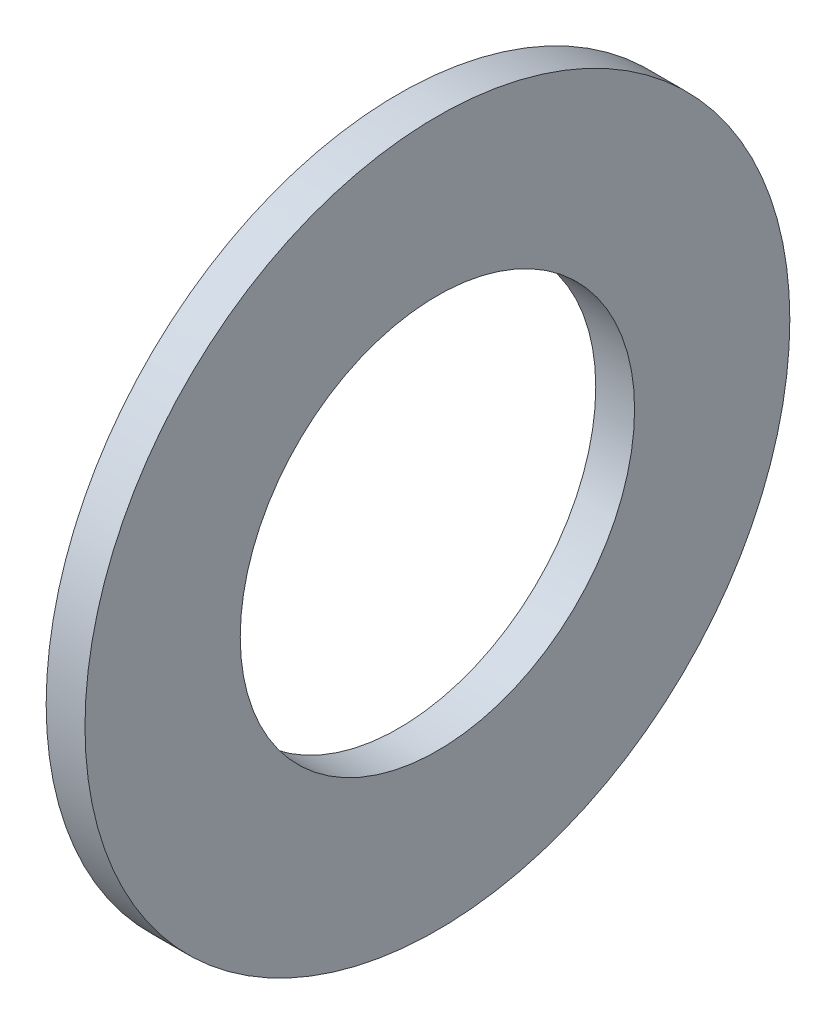
ISO-10303-21;
HEADER;
FILE_DESCRIPTION(('STEP AP214'),'2;1');
FILE_NAME('part.step','',(''),(''),'','','');
FILE_SCHEMA(('AUTOMOTIVE_DESIGN { 1 0 10303 214 1 1 1 1 }'));
ENDSEC;
DATA;
#1=APPLICATION_CONTEXT('core data for automotive mechanical design processes');
#2=APPLICATION_PROTOCOL_DEFINITION('international standard','automotive_design',2000,#1);
#3=PRODUCT_CONTEXT('',#1,'mechanical');
#4=PRODUCT('Part','Part','',(#3));
#5=PRODUCT_RELATED_PRODUCT_CATEGORY('part','',(#4));
#6=PRODUCT_DEFINITION_FORMATION('','',#4);
#7=PRODUCT_DEFINITION_CONTEXT('part definition',#1,'design');
#8=PRODUCT_DEFINITION('design','',#6,#7);
#9=PRODUCT_DEFINITION_SHAPE('','',#8);
#10=(LENGTH_UNIT() NAMED_UNIT(*) SI_UNIT(.MILLI.,.METRE.));
#11=(NAMED_UNIT(*) PLANE_ANGLE_UNIT() SI_UNIT($,.RADIAN.));
#12=(NAMED_UNIT(*) SI_UNIT($,.STERADIAN.) SOLID_ANGLE_UNIT());
#13=UNCERTAINTY_MEASURE_WITH_UNIT(LENGTH_MEASURE(1.E-05),#10,'distance_accuracy_value','');
#14=(GEOMETRIC_REPRESENTATION_CONTEXT(3) GLOBAL_UNCERTAINTY_ASSIGNED_CONTEXT((#13)) GLOBAL_UNIT_ASSIGNED_CONTEXT((#10,
#11,#12)) REPRESENTATION_CONTEXT('',''));
#15=CARTESIAN_POINT('',(0.,0.,0.));
#16=DIRECTION('',(0.,0.,1.));
#17=DIRECTION('',(1.,0.,0.));
#18=AXIS2_PLACEMENT_3D('',#15,#16,#17);
#19=CARTESIAN_POINT('',(5.,0.,0.));
#20=DIRECTION('',(1.,0.,0.));
#21=DIRECTION('',(0.,0.,-1.));
#22=AXIS2_PLACEMENT_3D('',#19,#20,#21);
#23=PLANE('',#22);
#24=CARTESIAN_POINT('',(5.,0.,0.));
#25=DIRECTION('',(1.,0.,0.));
#26=DIRECTION('',(0.,0.,-1.));
#27=AXIS2_PLACEMENT_3D('',#24,#25,#26);
#28=CIRCLE('',#27,45.4);
#29=CARTESIAN_POINT('',(5.,0.,-45.4));
#30=VERTEX_POINT('',#29);
#31=EDGE_CURVE('E10',#30,#30,#28,.T.);
#32=ORIENTED_EDGE('',*,*,#31,.T.);
#33=EDGE_LOOP('',(#32));
#34=FACE_BOUND('',#33,.T.);
#35=CARTESIAN_POINT('',(5.,0.,0.));
#36=DIRECTION('',(1.,0.,0.));
#37=DIRECTION('',(0.,0.,-1.));
#38=AXIS2_PLACEMENT_3D('',#35,#36,#37);
#39=CIRCLE('',#38,25.4);
#40=CARTESIAN_POINT('',(5.,0.,-25.4));
#41=VERTEX_POINT('',#40);
#42=EDGE_CURVE('E42',#41,#41,#39,.T.);
#43=ORIENTED_EDGE('',*,*,#42,.F.);
#44=EDGE_LOOP('',(#43));
#45=FACE_BOUND('',#44,.T.);
#46=ADVANCED_FACE('F31',(#34,#45),#23,.T.);
#47=CARTESIAN_POINT('',(0.,0.,0.));
#48=DIRECTION('',(1.,0.,0.));
#49=DIRECTION('',(0.,0.,-1.));
#50=AXIS2_PLACEMENT_3D('',#47,#48,#49);
#51=PLANE('',#50);
#52=CARTESIAN_POINT('',(0.,0.,0.));
#53=DIRECTION('',(1.,0.,0.));
#54=DIRECTION('',(0.,0.,-1.));
#55=AXIS2_PLACEMENT_3D('',#52,#53,#54);
#56=CIRCLE('',#55,45.4);
#57=CARTESIAN_POINT('',(0.,0.,-45.4));
#58=VERTEX_POINT('',#57);
#59=EDGE_CURVE('E35',#58,#58,#56,.T.);
#60=ORIENTED_EDGE('',*,*,#59,.F.);
#61=EDGE_LOOP('',(#60));
#62=FACE_BOUND('',#61,.T.);
#63=CARTESIAN_POINT('',(0.,0.,0.));
#64=DIRECTION('',(1.,0.,0.));
#65=DIRECTION('',(0.,0.,-1.));
#66=AXIS2_PLACEMENT_3D('',#63,#64,#65);
#67=CIRCLE('',#66,25.4);
#68=CARTESIAN_POINT('',(0.,0.,-25.4));
#69=VERTEX_POINT('',#68);
#70=EDGE_CURVE('E44',#69,#69,#67,.T.);
#71=ORIENTED_EDGE('',*,*,#70,.T.);
#72=EDGE_LOOP('',(#71));
#73=FACE_BOUND('',#72,.T.);
#74=ADVANCED_FACE('F54',(#62,#73),#51,.F.);
#75=CARTESIAN_POINT('',(5.,0.,0.));
#76=DIRECTION('',(-1.,0.,0.));
#77=DIRECTION('',(0.,0.,1.));
#78=AXIS2_PLACEMENT_3D('',#75,#76,#77);
#79=CYLINDRICAL_SURFACE('',#78,45.4);
#80=ORIENTED_EDGE('',*,*,#31,.F.);
#81=EDGE_LOOP('',(#80));
#82=FACE_BOUND('',#81,.T.);
#83=ORIENTED_EDGE('',*,*,#59,.T.);
#84=EDGE_LOOP('',(#83));
#85=FACE_BOUND('',#84,.T.);
#86=ADVANCED_FACE('F33',(#82,#85),#79,.T.);
#87=CARTESIAN_POINT('',(5.,0.,0.));
#88=DIRECTION('',(-1.,0.,0.));
#89=DIRECTION('',(0.,0.,1.));
#90=AXIS2_PLACEMENT_3D('',#87,#88,#89);
#91=CYLINDRICAL_SURFACE('',#90,25.4);
#92=ORIENTED_EDGE('',*,*,#42,.T.);
#93=EDGE_LOOP('',(#92));
#94=FACE_BOUND('',#93,.T.);
#95=ORIENTED_EDGE('',*,*,#70,.F.);
#96=EDGE_LOOP('',(#95));
#97=FACE_BOUND('',#96,.T.);
#98=ADVANCED_FACE('F50',(#94,#97),#91,.F.);
#99=CLOSED_SHELL('',(#46,#74,#86,#98));
#100=MANIFOLD_SOLID_BREP('B2',#99);
#101=ADVANCED_BREP_SHAPE_REPRESENTATION('',(#18,#100),#14);
#102=SHAPE_DEFINITION_REPRESENTATION(#9,#101);
ENDSEC;
END-ISO-10303-21;
